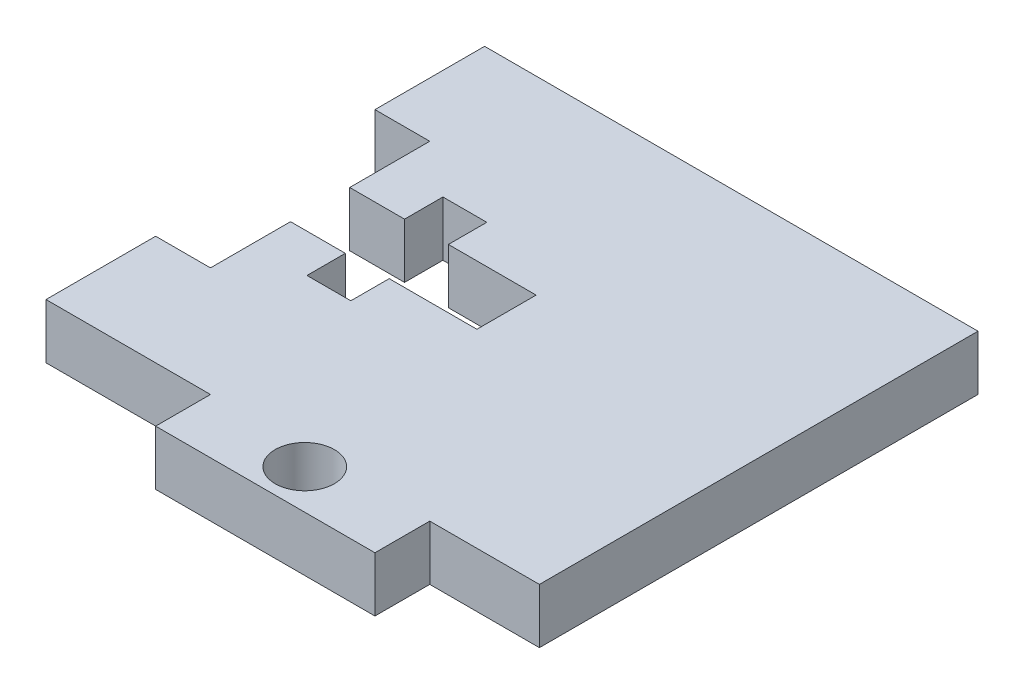
ISO-10303-21;
HEADER;
FILE_DESCRIPTION(('STEP AP214'),'2;1');
FILE_NAME('part.step','',(''),(''),'','','');
FILE_SCHEMA(('AUTOMOTIVE_DESIGN { 1 0 10303 214 1 1 1 1 }'));
ENDSEC;
DATA;
#1=APPLICATION_CONTEXT('core data for automotive mechanical design processes');
#2=APPLICATION_PROTOCOL_DEFINITION('international standard','automotive_design',2000,#1);
#3=PRODUCT_CONTEXT('',#1,'mechanical');
#4=PRODUCT('Part','Part','',(#3));
#5=PRODUCT_RELATED_PRODUCT_CATEGORY('part','',(#4));
#6=PRODUCT_DEFINITION_FORMATION('','',#4);
#7=PRODUCT_DEFINITION_CONTEXT('part definition',#1,'design');
#8=PRODUCT_DEFINITION('design','',#6,#7);
#9=PRODUCT_DEFINITION_SHAPE('','',#8);
#10=(LENGTH_UNIT() NAMED_UNIT(*) SI_UNIT(.MILLI.,.METRE.));
#11=(NAMED_UNIT(*) PLANE_ANGLE_UNIT() SI_UNIT($,.RADIAN.));
#12=(NAMED_UNIT(*) SI_UNIT($,.STERADIAN.) SOLID_ANGLE_UNIT());
#13=UNCERTAINTY_MEASURE_WITH_UNIT(LENGTH_MEASURE(1.E-05),#10,'distance_accuracy_value','');
#14=(GEOMETRIC_REPRESENTATION_CONTEXT(3) GLOBAL_UNCERTAINTY_ASSIGNED_CONTEXT((#13)) GLOBAL_UNIT_ASSIGNED_CONTEXT((#10,
#11,#12)) REPRESENTATION_CONTEXT('',''));
#15=CARTESIAN_POINT('',(0.,0.,0.));
#16=DIRECTION('',(0.,0.,1.));
#17=DIRECTION('',(1.,0.,0.));
#18=AXIS2_PLACEMENT_3D('',#15,#16,#17);
#19=CARTESIAN_POINT('',(0.,3.175,0.));
#20=DIRECTION('',(0.,-1.,0.));
#21=DIRECTION('',(0.,0.,-1.));
#22=AXIS2_PLACEMENT_3D('',#19,#20,#21);
#23=PLANE('',#22);
#24=DIRECTION('',(1.,0.,0.));
#25=VECTOR('',#24,1.);
#26=CARTESIAN_POINT('',(0.,3.175,0.));
#27=LINE('',#26,#25);
#28=CARTESIAN_POINT('',(0.,3.175,0.));
#29=VERTEX_POINT('',#28);
#30=CARTESIAN_POINT('',(9.525,3.175,0.));
#31=VERTEX_POINT('',#30);
#32=EDGE_CURVE('E274',#29,#31,#27,.T.);
#33=ORIENTED_EDGE('',*,*,#32,.T.);
#34=DIRECTION('',(0.,0.,1.));
#35=VECTOR('',#34,1.);
#36=CARTESIAN_POINT('',(9.525,3.175,0.));
#37=LINE('',#36,#35);
#38=CARTESIAN_POINT('',(9.525,3.175,3.175));
#39=VERTEX_POINT('',#38);
#40=EDGE_CURVE('E142',#31,#39,#37,.T.);
#41=ORIENTED_EDGE('',*,*,#40,.T.);
#42=DIRECTION('',(1.,0.,0.));
#43=VECTOR('',#42,1.);
#44=CARTESIAN_POINT('',(9.525,3.175,3.175));
#45=LINE('',#44,#43);
#46=CARTESIAN_POINT('',(22.225,3.175,3.175));
#47=VERTEX_POINT('',#46);
#48=EDGE_CURVE('E337',#39,#47,#45,.T.);
#49=ORIENTED_EDGE('',*,*,#48,.T.);
#50=DIRECTION('',(0.,0.,-1.));
#51=VECTOR('',#50,1.);
#52=CARTESIAN_POINT('',(22.225,3.175,3.175));
#53=LINE('',#52,#51);
#54=CARTESIAN_POINT('',(22.225,3.175,0.));
#55=VERTEX_POINT('',#54);
#56=EDGE_CURVE('E356',#47,#55,#53,.T.);
#57=ORIENTED_EDGE('',*,*,#56,.T.);
#58=DIRECTION('',(1.,0.,0.));
#59=VECTOR('',#58,1.);
#60=CARTESIAN_POINT('',(22.225,3.175,0.));
#61=LINE('',#60,#59);
#62=CARTESIAN_POINT('',(28.575,3.175,0.));
#63=VERTEX_POINT('',#62);
#64=EDGE_CURVE('E353',#55,#63,#61,.T.);
#65=ORIENTED_EDGE('',*,*,#64,.T.);
#66=DIRECTION('',(0.,0.,-1.));
#67=VECTOR('',#66,1.);
#68=CARTESIAN_POINT('',(28.575,3.175,0.));
#69=LINE('',#68,#67);
#70=CARTESIAN_POINT('',(28.575,3.175,-25.4));
#71=VERTEX_POINT('',#70);
#72=EDGE_CURVE('E355',#63,#71,#69,.T.);
#73=ORIENTED_EDGE('',*,*,#72,.T.);
#74=DIRECTION('',(-1.,0.,0.));
#75=VECTOR('',#74,1.);
#76=CARTESIAN_POINT('',(0.,3.175,-25.4));
#77=LINE('',#76,#75);
#78=CARTESIAN_POINT('',(0.,3.175,-25.4));
#79=VERTEX_POINT('',#78);
#80=EDGE_CURVE('E358',#71,#79,#77,.T.);
#81=ORIENTED_EDGE('',*,*,#80,.T.);
#82=DIRECTION('',(0.,0.,1.));
#83=VECTOR('',#82,1.);
#84=CARTESIAN_POINT('',(0.,3.175,-19.05));
#85=LINE('',#84,#83);
#86=CARTESIAN_POINT('',(0.,3.175,-19.05));
#87=VERTEX_POINT('',#86);
#88=EDGE_CURVE('E364',#79,#87,#85,.T.);
#89=ORIENTED_EDGE('',*,*,#88,.T.);
#90=DIRECTION('',(1.,0.,0.));
#91=VECTOR('',#90,1.);
#92=CARTESIAN_POINT('',(0.,3.175,-19.05));
#93=LINE('',#92,#91);
#94=CARTESIAN_POINT('',(3.175,3.175,-19.05));
#95=VERTEX_POINT('',#94);
#96=EDGE_CURVE('E366',#87,#95,#93,.T.);
#97=ORIENTED_EDGE('',*,*,#96,.T.);
#98=DIRECTION('',(0.,0.,1.));
#99=VECTOR('',#98,1.);
#100=CARTESIAN_POINT('',(3.175,3.175,-19.05));
#101=LINE('',#100,#99);
#102=CARTESIAN_POINT('',(3.175,3.175,-14.4145));
#103=VERTEX_POINT('',#102);
#104=EDGE_CURVE('E368',#95,#103,#101,.T.);
#105=ORIENTED_EDGE('',*,*,#104,.T.);
#106=DIRECTION('',(1.,0.,0.));
#107=VECTOR('',#106,1.);
#108=CARTESIAN_POINT('',(3.175,3.175,-14.4145));
#109=LINE('',#108,#107);
#110=CARTESIAN_POINT('',(6.35,3.175,-14.4145));
#111=VERTEX_POINT('',#110);
#112=EDGE_CURVE('E370',#103,#111,#109,.T.);
#113=ORIENTED_EDGE('',*,*,#112,.T.);
#114=DIRECTION('',(0.,0.,-1.));
#115=VECTOR('',#114,1.);
#116=CARTESIAN_POINT('',(6.35,3.175,-14.4145));
#117=LINE('',#116,#115);
#118=CARTESIAN_POINT('',(6.35,3.175,-16.637));
#119=VERTEX_POINT('',#118);
#120=EDGE_CURVE('E372',#111,#119,#117,.T.);
#121=ORIENTED_EDGE('',*,*,#120,.T.);
#122=DIRECTION('',(1.,0.,0.));
#123=VECTOR('',#122,1.);
#124=CARTESIAN_POINT('',(6.35,3.175,-16.637));
#125=LINE('',#124,#123);
#126=CARTESIAN_POINT('',(8.89,3.175,-16.637));
#127=VERTEX_POINT('',#126);
#128=EDGE_CURVE('E374',#119,#127,#125,.T.);
#129=ORIENTED_EDGE('',*,*,#128,.T.);
#130=DIRECTION('',(0.,0.,1.));
#131=VECTOR('',#130,1.);
#132=CARTESIAN_POINT('',(8.89,3.175,-16.637));
#133=LINE('',#132,#131);
#134=CARTESIAN_POINT('',(8.89,3.175,-14.4145));
#135=VERTEX_POINT('',#134);
#136=EDGE_CURVE('E376',#127,#135,#133,.T.);
#137=ORIENTED_EDGE('',*,*,#136,.T.);
#138=DIRECTION('',(1.,0.,0.));
#139=VECTOR('',#138,1.);
#140=CARTESIAN_POINT('',(8.89,3.175,-14.4145));
#141=LINE('',#140,#139);
#142=CARTESIAN_POINT('',(13.97,3.175,-14.4145));
#143=VERTEX_POINT('',#142);
#144=EDGE_CURVE('E378',#135,#143,#141,.T.);
#145=ORIENTED_EDGE('',*,*,#144,.T.);
#146=DIRECTION('',(0.,0.,1.));
#147=VECTOR('',#146,1.);
#148=CARTESIAN_POINT('',(13.97,3.175,-10.9855));
#149=LINE('',#148,#147);
#150=CARTESIAN_POINT('',(13.97,3.175,-10.9855));
#151=VERTEX_POINT('',#150);
#152=EDGE_CURVE('E380',#143,#151,#149,.T.);
#153=ORIENTED_EDGE('',*,*,#152,.T.);
#154=DIRECTION('',(-1.,0.,0.));
#155=VECTOR('',#154,1.);
#156=CARTESIAN_POINT('',(8.89,3.175,-10.9855));
#157=LINE('',#156,#155);
#158=CARTESIAN_POINT('',(8.89,3.175,-10.9855));
#159=VERTEX_POINT('',#158);
#160=EDGE_CURVE('E382',#151,#159,#157,.T.);
#161=ORIENTED_EDGE('',*,*,#160,.T.);
#162=DIRECTION('',(0.,0.,1.));
#163=VECTOR('',#162,1.);
#164=CARTESIAN_POINT('',(8.89,3.175,-8.763));
#165=LINE('',#164,#163);
#166=CARTESIAN_POINT('',(8.89,3.175,-8.763));
#167=VERTEX_POINT('',#166);
#168=EDGE_CURVE('E384',#159,#167,#165,.T.);
#169=ORIENTED_EDGE('',*,*,#168,.T.);
#170=DIRECTION('',(-1.,0.,0.));
#171=VECTOR('',#170,1.);
#172=CARTESIAN_POINT('',(6.35,3.175,-8.763));
#173=LINE('',#172,#171);
#174=CARTESIAN_POINT('',(6.35,3.175,-8.763));
#175=VERTEX_POINT('',#174);
#176=EDGE_CURVE('E386',#167,#175,#173,.T.);
#177=ORIENTED_EDGE('',*,*,#176,.T.);
#178=DIRECTION('',(0.,0.,-1.));
#179=VECTOR('',#178,1.);
#180=CARTESIAN_POINT('',(6.35,3.175,-10.9855));
#181=LINE('',#180,#179);
#182=CARTESIAN_POINT('',(6.35,3.175,-10.9855));
#183=VERTEX_POINT('',#182);
#184=EDGE_CURVE('E388',#175,#183,#181,.T.);
#185=ORIENTED_EDGE('',*,*,#184,.T.);
#186=DIRECTION('',(-1.,0.,0.));
#187=VECTOR('',#186,1.);
#188=CARTESIAN_POINT('',(3.175,3.175,-10.9855));
#189=LINE('',#188,#187);
#190=CARTESIAN_POINT('',(3.175,3.175,-10.9855));
#191=VERTEX_POINT('',#190);
#192=EDGE_CURVE('E209',#183,#191,#189,.T.);
#193=ORIENTED_EDGE('',*,*,#192,.T.);
#194=DIRECTION('',(0.,0.,1.));
#195=VECTOR('',#194,1.);
#196=CARTESIAN_POINT('',(3.175,3.175,-6.35));
#197=LINE('',#196,#195);
#198=CARTESIAN_POINT('',(3.175,3.175,-6.35));
#199=VERTEX_POINT('',#198);
#200=EDGE_CURVE('E203',#191,#199,#197,.T.);
#201=ORIENTED_EDGE('',*,*,#200,.T.);
#202=DIRECTION('',(-1.,0.,0.));
#203=VECTOR('',#202,1.);
#204=CARTESIAN_POINT('',(3.175,3.175,-6.35));
#205=LINE('',#204,#203);
#206=CARTESIAN_POINT('',(0.,3.175,-6.35));
#207=VERTEX_POINT('',#206);
#208=EDGE_CURVE('E207',#199,#207,#205,.T.);
#209=ORIENTED_EDGE('',*,*,#208,.T.);
#210=DIRECTION('',(0.,0.,1.));
#211=VECTOR('',#210,1.);
#212=CARTESIAN_POINT('',(0.,3.175,0.));
#213=LINE('',#212,#211);
#214=EDGE_CURVE('E51',#207,#29,#213,.T.);
#215=ORIENTED_EDGE('',*,*,#214,.T.);
#216=EDGE_LOOP('',(#33,#41,#49,#57,#65,#73,#81,#89,#97,#105,#113,#121,#129,#137,#145,#153,#161,
#169,#177,#185,#193,#201,#209,#215));
#217=FACE_BOUND('',#216,.T.);
#218=CARTESIAN_POINT('',(15.875,3.175,0.889));
#219=DIRECTION('',(0.,1.,0.));
#220=DIRECTION('',(0.,0.,1.));
#221=AXIS2_PLACEMENT_3D('',#218,#219,#220);
#222=CIRCLE('',#221,1.71449999999999);
#223=CARTESIAN_POINT('',(15.875,3.175,2.60349999999999));
#224=VERTEX_POINT('',#223);
#225=EDGE_CURVE('E231',#224,#224,#222,.T.);
#226=ORIENTED_EDGE('',*,*,#225,.F.);
#227=EDGE_LOOP('',(#226));
#228=FACE_BOUND('',#227,.T.);
#229=ADVANCED_FACE('F34',(#217,#228),#23,.F.);
#230=CARTESIAN_POINT('',(0.,0.,0.));
#231=DIRECTION('',(0.,-1.,0.));
#232=DIRECTION('',(0.,0.,-1.));
#233=AXIS2_PLACEMENT_3D('',#230,#231,#232);
#234=PLANE('',#233);
#235=DIRECTION('',(1.,0.,0.));
#236=VECTOR('',#235,1.);
#237=CARTESIAN_POINT('',(0.,0.,0.));
#238=LINE('',#237,#236);
#239=CARTESIAN_POINT('',(0.,0.,0.));
#240=VERTEX_POINT('',#239);
#241=CARTESIAN_POINT('',(9.525,0.,0.));
#242=VERTEX_POINT('',#241);
#243=EDGE_CURVE('E227',#240,#242,#238,.T.);
#244=ORIENTED_EDGE('',*,*,#243,.F.);
#245=DIRECTION('',(0.,0.,1.));
#246=VECTOR('',#245,1.);
#247=CARTESIAN_POINT('',(0.,0.,0.));
#248=LINE('',#247,#246);
#249=CARTESIAN_POINT('',(0.,0.,-6.35));
#250=VERTEX_POINT('',#249);
#251=EDGE_CURVE('E134',#250,#240,#248,.T.);
#252=ORIENTED_EDGE('',*,*,#251,.F.);
#253=DIRECTION('',(-1.,0.,0.));
#254=VECTOR('',#253,1.);
#255=CARTESIAN_POINT('',(3.175,0.,-6.35));
#256=LINE('',#255,#254);
#257=CARTESIAN_POINT('',(3.175,0.,-6.35));
#258=VERTEX_POINT('',#257);
#259=EDGE_CURVE('E128',#258,#250,#256,.T.);
#260=ORIENTED_EDGE('',*,*,#259,.F.);
#261=DIRECTION('',(0.,0.,1.));
#262=VECTOR('',#261,1.);
#263=CARTESIAN_POINT('',(3.175,0.,-6.35));
#264=LINE('',#263,#262);
#265=CARTESIAN_POINT('',(3.175,0.,-10.9855));
#266=VERTEX_POINT('',#265);
#267=EDGE_CURVE('E217',#266,#258,#264,.T.);
#268=ORIENTED_EDGE('',*,*,#267,.F.);
#269=DIRECTION('',(-1.,0.,0.));
#270=VECTOR('',#269,1.);
#271=CARTESIAN_POINT('',(3.175,0.,-10.9855));
#272=LINE('',#271,#270);
#273=CARTESIAN_POINT('',(6.35,0.,-10.9855));
#274=VERTEX_POINT('',#273);
#275=EDGE_CURVE('E269',#274,#266,#272,.T.);
#276=ORIENTED_EDGE('',*,*,#275,.F.);
#277=DIRECTION('',(0.,0.,-1.));
#278=VECTOR('',#277,1.);
#279=CARTESIAN_POINT('',(6.35,0.,-10.9855));
#280=LINE('',#279,#278);
#281=CARTESIAN_POINT('',(6.35,0.,-8.763));
#282=VERTEX_POINT('',#281);
#283=EDGE_CURVE('E267',#282,#274,#280,.T.);
#284=ORIENTED_EDGE('',*,*,#283,.F.);
#285=DIRECTION('',(-1.,0.,0.));
#286=VECTOR('',#285,1.);
#287=CARTESIAN_POINT('',(6.35,0.,-8.763));
#288=LINE('',#287,#286);
#289=CARTESIAN_POINT('',(8.89,0.,-8.763));
#290=VERTEX_POINT('',#289);
#291=EDGE_CURVE('E265',#290,#282,#288,.T.);
#292=ORIENTED_EDGE('',*,*,#291,.F.);
#293=DIRECTION('',(0.,0.,1.));
#294=VECTOR('',#293,1.);
#295=CARTESIAN_POINT('',(8.89,0.,-8.763));
#296=LINE('',#295,#294);
#297=CARTESIAN_POINT('',(8.89,0.,-10.9855));
#298=VERTEX_POINT('',#297);
#299=EDGE_CURVE('E263',#298,#290,#296,.T.);
#300=ORIENTED_EDGE('',*,*,#299,.F.);
#301=DIRECTION('',(-1.,0.,0.));
#302=VECTOR('',#301,1.);
#303=CARTESIAN_POINT('',(8.89,0.,-10.9855));
#304=LINE('',#303,#302);
#305=CARTESIAN_POINT('',(13.97,0.,-10.9855));
#306=VERTEX_POINT('',#305);
#307=EDGE_CURVE('E261',#306,#298,#304,.T.);
#308=ORIENTED_EDGE('',*,*,#307,.F.);
#309=DIRECTION('',(0.,0.,1.));
#310=VECTOR('',#309,1.);
#311=CARTESIAN_POINT('',(13.97,0.,-10.9855));
#312=LINE('',#311,#310);
#313=CARTESIAN_POINT('',(13.97,0.,-14.4145));
#314=VERTEX_POINT('',#313);
#315=EDGE_CURVE('E259',#314,#306,#312,.T.);
#316=ORIENTED_EDGE('',*,*,#315,.F.);
#317=DIRECTION('',(1.,0.,0.));
#318=VECTOR('',#317,1.);
#319=CARTESIAN_POINT('',(8.89,0.,-14.4145));
#320=LINE('',#319,#318);
#321=CARTESIAN_POINT('',(8.89,0.,-14.4145));
#322=VERTEX_POINT('',#321);
#323=EDGE_CURVE('E257',#322,#314,#320,.T.);
#324=ORIENTED_EDGE('',*,*,#323,.F.);
#325=DIRECTION('',(0.,0.,1.));
#326=VECTOR('',#325,1.);
#327=CARTESIAN_POINT('',(8.89,0.,-16.637));
#328=LINE('',#327,#326);
#329=CARTESIAN_POINT('',(8.89,0.,-16.637));
#330=VERTEX_POINT('',#329);
#331=EDGE_CURVE('E255',#330,#322,#328,.T.);
#332=ORIENTED_EDGE('',*,*,#331,.F.);
#333=DIRECTION('',(1.,0.,0.));
#334=VECTOR('',#333,1.);
#335=CARTESIAN_POINT('',(6.35,0.,-16.637));
#336=LINE('',#335,#334);
#337=CARTESIAN_POINT('',(6.35,0.,-16.637));
#338=VERTEX_POINT('',#337);
#339=EDGE_CURVE('E253',#338,#330,#336,.T.);
#340=ORIENTED_EDGE('',*,*,#339,.F.);
#341=DIRECTION('',(0.,0.,-1.));
#342=VECTOR('',#341,1.);
#343=CARTESIAN_POINT('',(6.35,0.,-14.4145));
#344=LINE('',#343,#342);
#345=CARTESIAN_POINT('',(6.35,0.,-14.4145));
#346=VERTEX_POINT('',#345);
#347=EDGE_CURVE('E251',#346,#338,#344,.T.);
#348=ORIENTED_EDGE('',*,*,#347,.F.);
#349=DIRECTION('',(1.,0.,0.));
#350=VECTOR('',#349,1.);
#351=CARTESIAN_POINT('',(3.175,0.,-14.4145));
#352=LINE('',#351,#350);
#353=CARTESIAN_POINT('',(3.175,0.,-14.4145));
#354=VERTEX_POINT('',#353);
#355=EDGE_CURVE('E249',#354,#346,#352,.T.);
#356=ORIENTED_EDGE('',*,*,#355,.F.);
#357=DIRECTION('',(0.,0.,1.));
#358=VECTOR('',#357,1.);
#359=CARTESIAN_POINT('',(3.175,0.,-19.05));
#360=LINE('',#359,#358);
#361=CARTESIAN_POINT('',(3.175,0.,-19.05));
#362=VERTEX_POINT('',#361);
#363=EDGE_CURVE('E247',#362,#354,#360,.T.);
#364=ORIENTED_EDGE('',*,*,#363,.F.);
#365=DIRECTION('',(1.,0.,0.));
#366=VECTOR('',#365,1.);
#367=CARTESIAN_POINT('',(0.,0.,-19.05));
#368=LINE('',#367,#366);
#369=CARTESIAN_POINT('',(0.,0.,-19.05));
#370=VERTEX_POINT('',#369);
#371=EDGE_CURVE('E245',#370,#362,#368,.T.);
#372=ORIENTED_EDGE('',*,*,#371,.F.);
#373=DIRECTION('',(0.,0.,1.));
#374=VECTOR('',#373,1.);
#375=CARTESIAN_POINT('',(0.,0.,-19.05));
#376=LINE('',#375,#374);
#377=CARTESIAN_POINT('',(0.,0.,-25.4));
#378=VERTEX_POINT('',#377);
#379=EDGE_CURVE('E243',#378,#370,#376,.T.);
#380=ORIENTED_EDGE('',*,*,#379,.F.);
#381=DIRECTION('',(-1.,0.,0.));
#382=VECTOR('',#381,1.);
#383=CARTESIAN_POINT('',(0.,0.,-25.4));
#384=LINE('',#383,#382);
#385=CARTESIAN_POINT('',(28.575,0.,-25.4));
#386=VERTEX_POINT('',#385);
#387=EDGE_CURVE('E241',#386,#378,#384,.T.);
#388=ORIENTED_EDGE('',*,*,#387,.F.);
#389=DIRECTION('',(0.,0.,-1.));
#390=VECTOR('',#389,1.);
#391=CARTESIAN_POINT('',(28.575,0.,0.));
#392=LINE('',#391,#390);
#393=CARTESIAN_POINT('',(28.575,0.,0.));
#394=VERTEX_POINT('',#393);
#395=EDGE_CURVE('E239',#394,#386,#392,.T.);
#396=ORIENTED_EDGE('',*,*,#395,.F.);
#397=DIRECTION('',(1.,0.,0.));
#398=VECTOR('',#397,1.);
#399=CARTESIAN_POINT('',(22.225,0.,0.));
#400=LINE('',#399,#398);
#401=CARTESIAN_POINT('',(22.225,0.,0.));
#402=VERTEX_POINT('',#401);
#403=EDGE_CURVE('E237',#402,#394,#400,.T.);
#404=ORIENTED_EDGE('',*,*,#403,.F.);
#405=DIRECTION('',(0.,0.,-1.));
#406=VECTOR('',#405,1.);
#407=CARTESIAN_POINT('',(22.225,0.,3.175));
#408=LINE('',#407,#406);
#409=CARTESIAN_POINT('',(22.225,0.,3.175));
#410=VERTEX_POINT('',#409);
#411=EDGE_CURVE('E235',#410,#402,#408,.T.);
#412=ORIENTED_EDGE('',*,*,#411,.F.);
#413=DIRECTION('',(1.,0.,0.));
#414=VECTOR('',#413,1.);
#415=CARTESIAN_POINT('',(9.525,0.,3.175));
#416=LINE('',#415,#414);
#417=CARTESIAN_POINT('',(9.525,0.,3.175));
#418=VERTEX_POINT('',#417);
#419=EDGE_CURVE('E233',#418,#410,#416,.T.);
#420=ORIENTED_EDGE('',*,*,#419,.F.);
#421=DIRECTION('',(0.,0.,1.));
#422=VECTOR('',#421,1.);
#423=CARTESIAN_POINT('',(9.525,0.,0.));
#424=LINE('',#423,#422);
#425=EDGE_CURVE('E230',#242,#418,#424,.T.);
#426=ORIENTED_EDGE('',*,*,#425,.F.);
#427=EDGE_LOOP('',(#244,#252,#260,#268,#276,#284,#292,#300,#308,#316,#324,#332,#340,#348,#356,
#364,#372,#380,#388,#396,#404,#412,#420,#426));
#428=FACE_BOUND('',#427,.T.);
#429=CARTESIAN_POINT('',(15.875,0.,0.889));
#430=DIRECTION('',(0.,1.,0.));
#431=DIRECTION('',(0.,0.,1.));
#432=AXIS2_PLACEMENT_3D('',#429,#430,#431);
#433=CIRCLE('',#432,1.71449999999999);
#434=CARTESIAN_POINT('',(15.875,0.,2.60349999999999));
#435=VERTEX_POINT('',#434);
#436=EDGE_CURVE('E691',#435,#435,#433,.T.);
#437=ORIENTED_EDGE('',*,*,#436,.T.);
#438=EDGE_LOOP('',(#437));
#439=FACE_BOUND('',#438,.T.);
#440=ADVANCED_FACE('F341',(#428,#439),#234,.T.);
#441=CARTESIAN_POINT('',(0.,3.175,0.));
#442=DIRECTION('',(0.,0.,-1.));
#443=DIRECTION('',(-1.,0.,0.));
#444=AXIS2_PLACEMENT_3D('',#441,#442,#443);
#445=PLANE('',#444);
#446=ORIENTED_EDGE('',*,*,#243,.T.);
#447=DIRECTION('',(0.,-1.,0.));
#448=VECTOR('',#447,1.);
#449=CARTESIAN_POINT('',(9.525,3.175,0.));
#450=LINE('',#449,#448);
#451=EDGE_CURVE('E11',#31,#242,#450,.T.);
#452=ORIENTED_EDGE('',*,*,#451,.F.);
#453=ORIENTED_EDGE('',*,*,#32,.F.);
#454=DIRECTION('',(0.,-1.,0.));
#455=VECTOR('',#454,1.);
#456=CARTESIAN_POINT('',(0.,3.175,0.));
#457=LINE('',#456,#455);
#458=EDGE_CURVE('E223',#29,#240,#457,.T.);
#459=ORIENTED_EDGE('',*,*,#458,.T.);
#460=EDGE_LOOP('',(#446,#452,#453,#459));
#461=FACE_BOUND('',#460,.T.);
#462=ADVANCED_FACE('F36',(#461),#445,.F.);
#463=CARTESIAN_POINT('',(9.525,3.175,0.));
#464=DIRECTION('',(1.,0.,0.));
#465=DIRECTION('',(0.,0.,-1.));
#466=AXIS2_PLACEMENT_3D('',#463,#464,#465);
#467=PLANE('',#466);
#468=ORIENTED_EDGE('',*,*,#425,.T.);
#469=DIRECTION('',(0.,-1.,0.));
#470=VECTOR('',#469,1.);
#471=CARTESIAN_POINT('',(9.525,3.175,3.175));
#472=LINE('',#471,#470);
#473=EDGE_CURVE('E43',#39,#418,#472,.T.);
#474=ORIENTED_EDGE('',*,*,#473,.F.);
#475=ORIENTED_EDGE('',*,*,#40,.F.);
#476=ORIENTED_EDGE('',*,*,#451,.T.);
#477=EDGE_LOOP('',(#468,#474,#475,#476));
#478=FACE_BOUND('',#477,.T.);
#479=ADVANCED_FACE('F422',(#478),#467,.F.);
#480=CARTESIAN_POINT('',(9.525,3.175,3.175));
#481=DIRECTION('',(0.,0.,-1.));
#482=DIRECTION('',(-1.,0.,0.));
#483=AXIS2_PLACEMENT_3D('',#480,#481,#482);
#484=PLANE('',#483);
#485=ORIENTED_EDGE('',*,*,#419,.T.);
#486=DIRECTION('',(0.,-1.,0.));
#487=VECTOR('',#486,1.);
#488=CARTESIAN_POINT('',(22.225,3.175,3.175));
#489=LINE('',#488,#487);
#490=EDGE_CURVE('E329',#47,#410,#489,.T.);
#491=ORIENTED_EDGE('',*,*,#490,.F.);
#492=ORIENTED_EDGE('',*,*,#48,.F.);
#493=ORIENTED_EDGE('',*,*,#473,.T.);
#494=EDGE_LOOP('',(#485,#491,#492,#493));
#495=FACE_BOUND('',#494,.T.);
#496=ADVANCED_FACE('F335',(#495),#484,.F.);
#497=CARTESIAN_POINT('',(22.225,3.175,3.175));
#498=DIRECTION('',(-1.,0.,0.));
#499=DIRECTION('',(0.,0.,1.));
#500=AXIS2_PLACEMENT_3D('',#497,#498,#499);
#501=PLANE('',#500);
#502=ORIENTED_EDGE('',*,*,#411,.T.);
#503=DIRECTION('',(0.,-1.,0.));
#504=VECTOR('',#503,1.);
#505=CARTESIAN_POINT('',(22.225,3.175,0.));
#506=LINE('',#505,#504);
#507=EDGE_CURVE('E326',#55,#402,#506,.T.);
#508=ORIENTED_EDGE('',*,*,#507,.F.);
#509=ORIENTED_EDGE('',*,*,#56,.F.);
#510=ORIENTED_EDGE('',*,*,#490,.T.);
#511=EDGE_LOOP('',(#502,#508,#509,#510));
#512=FACE_BOUND('',#511,.T.);
#513=ADVANCED_FACE('F347',(#512),#501,.F.);
#514=CARTESIAN_POINT('',(22.225,3.175,0.));
#515=DIRECTION('',(0.,0.,-1.));
#516=DIRECTION('',(-1.,0.,0.));
#517=AXIS2_PLACEMENT_3D('',#514,#515,#516);
#518=PLANE('',#517);
#519=ORIENTED_EDGE('',*,*,#403,.T.);
#520=DIRECTION('',(0.,-1.,0.));
#521=VECTOR('',#520,1.);
#522=CARTESIAN_POINT('',(28.575,3.175,0.));
#523=LINE('',#522,#521);
#524=EDGE_CURVE('E323',#63,#394,#523,.T.);
#525=ORIENTED_EDGE('',*,*,#524,.F.);
#526=ORIENTED_EDGE('',*,*,#64,.F.);
#527=ORIENTED_EDGE('',*,*,#507,.T.);
#528=EDGE_LOOP('',(#519,#525,#526,#527));
#529=FACE_BOUND('',#528,.T.);
#530=ADVANCED_FACE('F351',(#529),#518,.F.);
#531=CARTESIAN_POINT('',(28.575,3.175,0.));
#532=DIRECTION('',(-1.,0.,0.));
#533=DIRECTION('',(0.,0.,1.));
#534=AXIS2_PLACEMENT_3D('',#531,#532,#533);
#535=PLANE('',#534);
#536=ORIENTED_EDGE('',*,*,#395,.T.);
#537=DIRECTION('',(0.,-1.,0.));
#538=VECTOR('',#537,1.);
#539=CARTESIAN_POINT('',(28.575,3.175,-25.4));
#540=LINE('',#539,#538);
#541=EDGE_CURVE('E320',#71,#386,#540,.T.);
#542=ORIENTED_EDGE('',*,*,#541,.F.);
#543=ORIENTED_EDGE('',*,*,#72,.F.);
#544=ORIENTED_EDGE('',*,*,#524,.T.);
#545=EDGE_LOOP('',(#536,#542,#543,#544));
#546=FACE_BOUND('',#545,.T.);
#547=ADVANCED_FACE('F435',(#546),#535,.F.);
#548=CARTESIAN_POINT('',(0.,3.175,-25.4));
#549=DIRECTION('',(0.,0.,1.));
#550=DIRECTION('',(1.,0.,0.));
#551=AXIS2_PLACEMENT_3D('',#548,#549,#550);
#552=PLANE('',#551);
#553=ORIENTED_EDGE('',*,*,#387,.T.);
#554=DIRECTION('',(0.,-1.,0.));
#555=VECTOR('',#554,1.);
#556=CARTESIAN_POINT('',(0.,3.175,-25.4));
#557=LINE('',#556,#555);
#558=EDGE_CURVE('E317',#79,#378,#557,.T.);
#559=ORIENTED_EDGE('',*,*,#558,.F.);
#560=ORIENTED_EDGE('',*,*,#80,.F.);
#561=ORIENTED_EDGE('',*,*,#541,.T.);
#562=EDGE_LOOP('',(#553,#559,#560,#561));
#563=FACE_BOUND('',#562,.T.);
#564=ADVANCED_FACE('F438',(#563),#552,.F.);
#565=CARTESIAN_POINT('',(0.,3.175,-19.05));
#566=DIRECTION('',(1.,0.,0.));
#567=DIRECTION('',(0.,0.,-1.));
#568=AXIS2_PLACEMENT_3D('',#565,#566,#567);
#569=PLANE('',#568);
#570=ORIENTED_EDGE('',*,*,#379,.T.);
#571=DIRECTION('',(0.,-1.,0.));
#572=VECTOR('',#571,1.);
#573=CARTESIAN_POINT('',(0.,3.175,-19.05));
#574=LINE('',#573,#572);
#575=EDGE_CURVE('E314',#87,#370,#574,.T.);
#576=ORIENTED_EDGE('',*,*,#575,.F.);
#577=ORIENTED_EDGE('',*,*,#88,.F.);
#578=ORIENTED_EDGE('',*,*,#558,.T.);
#579=EDGE_LOOP('',(#570,#576,#577,#578));
#580=FACE_BOUND('',#579,.T.);
#581=ADVANCED_FACE('F442',(#580),#569,.F.);
#582=CARTESIAN_POINT('',(0.,3.175,-19.05));
#583=DIRECTION('',(0.,0.,-1.));
#584=DIRECTION('',(-1.,0.,0.));
#585=AXIS2_PLACEMENT_3D('',#582,#583,#584);
#586=PLANE('',#585);
#587=ORIENTED_EDGE('',*,*,#371,.T.);
#588=DIRECTION('',(0.,-1.,0.));
#589=VECTOR('',#588,1.);
#590=CARTESIAN_POINT('',(3.175,3.175,-19.05));
#591=LINE('',#590,#589);
#592=EDGE_CURVE('E311',#95,#362,#591,.T.);
#593=ORIENTED_EDGE('',*,*,#592,.F.);
#594=ORIENTED_EDGE('',*,*,#96,.F.);
#595=ORIENTED_EDGE('',*,*,#575,.T.);
#596=EDGE_LOOP('',(#587,#593,#594,#595));
#597=FACE_BOUND('',#596,.T.);
#598=ADVANCED_FACE('F446',(#597),#586,.F.);
#599=CARTESIAN_POINT('',(3.175,3.175,-19.05));
#600=DIRECTION('',(1.,0.,0.));
#601=DIRECTION('',(0.,0.,-1.));
#602=AXIS2_PLACEMENT_3D('',#599,#600,#601);
#603=PLANE('',#602);
#604=ORIENTED_EDGE('',*,*,#363,.T.);
#605=DIRECTION('',(0.,-1.,0.));
#606=VECTOR('',#605,1.);
#607=CARTESIAN_POINT('',(3.175,3.175,-14.4145));
#608=LINE('',#607,#606);
#609=EDGE_CURVE('E308',#103,#354,#608,.T.);
#610=ORIENTED_EDGE('',*,*,#609,.F.);
#611=ORIENTED_EDGE('',*,*,#104,.F.);
#612=ORIENTED_EDGE('',*,*,#592,.T.);
#613=EDGE_LOOP('',(#604,#610,#611,#612));
#614=FACE_BOUND('',#613,.T.);
#615=ADVANCED_FACE('F450',(#614),#603,.F.);
#616=CARTESIAN_POINT('',(3.175,3.175,-14.4145));
#617=DIRECTION('',(0.,0.,-1.));
#618=DIRECTION('',(-1.,0.,0.));
#619=AXIS2_PLACEMENT_3D('',#616,#617,#618);
#620=PLANE('',#619);
#621=ORIENTED_EDGE('',*,*,#355,.T.);
#622=DIRECTION('',(0.,-1.,0.));
#623=VECTOR('',#622,1.);
#624=CARTESIAN_POINT('',(6.35,3.175,-14.4145));
#625=LINE('',#624,#623);
#626=EDGE_CURVE('E305',#111,#346,#625,.T.);
#627=ORIENTED_EDGE('',*,*,#626,.F.);
#628=ORIENTED_EDGE('',*,*,#112,.F.);
#629=ORIENTED_EDGE('',*,*,#609,.T.);
#630=EDGE_LOOP('',(#621,#627,#628,#629));
#631=FACE_BOUND('',#630,.T.);
#632=ADVANCED_FACE('F454',(#631),#620,.F.);
#633=CARTESIAN_POINT('',(6.35,3.175,-14.4145));
#634=DIRECTION('',(-1.,0.,0.));
#635=DIRECTION('',(0.,0.,1.));
#636=AXIS2_PLACEMENT_3D('',#633,#634,#635);
#637=PLANE('',#636);
#638=ORIENTED_EDGE('',*,*,#347,.T.);
#639=DIRECTION('',(0.,-1.,0.));
#640=VECTOR('',#639,1.);
#641=CARTESIAN_POINT('',(6.35,3.175,-16.637));
#642=LINE('',#641,#640);
#643=EDGE_CURVE('E302',#119,#338,#642,.T.);
#644=ORIENTED_EDGE('',*,*,#643,.F.);
#645=ORIENTED_EDGE('',*,*,#120,.F.);
#646=ORIENTED_EDGE('',*,*,#626,.T.);
#647=EDGE_LOOP('',(#638,#644,#645,#646));
#648=FACE_BOUND('',#647,.T.);
#649=ADVANCED_FACE('F458',(#648),#637,.F.);
#650=CARTESIAN_POINT('',(6.35,3.175,-16.637));
#651=DIRECTION('',(0.,0.,-1.));
#652=DIRECTION('',(-1.,0.,0.));
#653=AXIS2_PLACEMENT_3D('',#650,#651,#652);
#654=PLANE('',#653);
#655=ORIENTED_EDGE('',*,*,#339,.T.);
#656=DIRECTION('',(0.,-1.,0.));
#657=VECTOR('',#656,1.);
#658=CARTESIAN_POINT('',(8.89,3.175,-16.637));
#659=LINE('',#658,#657);
#660=EDGE_CURVE('E299',#127,#330,#659,.T.);
#661=ORIENTED_EDGE('',*,*,#660,.F.);
#662=ORIENTED_EDGE('',*,*,#128,.F.);
#663=ORIENTED_EDGE('',*,*,#643,.T.);
#664=EDGE_LOOP('',(#655,#661,#662,#663));
#665=FACE_BOUND('',#664,.T.);
#666=ADVANCED_FACE('F462',(#665),#654,.F.);
#667=CARTESIAN_POINT('',(8.89,3.175,-16.637));
#668=DIRECTION('',(1.,0.,0.));
#669=DIRECTION('',(0.,0.,-1.));
#670=AXIS2_PLACEMENT_3D('',#667,#668,#669);
#671=PLANE('',#670);
#672=ORIENTED_EDGE('',*,*,#331,.T.);
#673=DIRECTION('',(0.,-1.,0.));
#674=VECTOR('',#673,1.);
#675=CARTESIAN_POINT('',(8.89,3.175,-14.4145));
#676=LINE('',#675,#674);
#677=EDGE_CURVE('E296',#135,#322,#676,.T.);
#678=ORIENTED_EDGE('',*,*,#677,.F.);
#679=ORIENTED_EDGE('',*,*,#136,.F.);
#680=ORIENTED_EDGE('',*,*,#660,.T.);
#681=EDGE_LOOP('',(#672,#678,#679,#680));
#682=FACE_BOUND('',#681,.T.);
#683=ADVANCED_FACE('F466',(#682),#671,.F.);
#684=CARTESIAN_POINT('',(8.89,3.175,-14.4145));
#685=DIRECTION('',(0.,0.,-1.));
#686=DIRECTION('',(-1.,0.,0.));
#687=AXIS2_PLACEMENT_3D('',#684,#685,#686);
#688=PLANE('',#687);
#689=ORIENTED_EDGE('',*,*,#323,.T.);
#690=DIRECTION('',(0.,-1.,0.));
#691=VECTOR('',#690,1.);
#692=CARTESIAN_POINT('',(13.97,3.175,-14.4145));
#693=LINE('',#692,#691);
#694=EDGE_CURVE('E293',#143,#314,#693,.T.);
#695=ORIENTED_EDGE('',*,*,#694,.F.);
#696=ORIENTED_EDGE('',*,*,#144,.F.);
#697=ORIENTED_EDGE('',*,*,#677,.T.);
#698=EDGE_LOOP('',(#689,#695,#696,#697));
#699=FACE_BOUND('',#698,.T.);
#700=ADVANCED_FACE('F470',(#699),#688,.F.);
#701=CARTESIAN_POINT('',(13.97,3.175,-10.9855));
#702=DIRECTION('',(1.,0.,0.));
#703=DIRECTION('',(0.,0.,-1.));
#704=AXIS2_PLACEMENT_3D('',#701,#702,#703);
#705=PLANE('',#704);
#706=ORIENTED_EDGE('',*,*,#315,.T.);
#707=DIRECTION('',(0.,-1.,0.));
#708=VECTOR('',#707,1.);
#709=CARTESIAN_POINT('',(13.97,3.175,-10.9855));
#710=LINE('',#709,#708);
#711=EDGE_CURVE('E290',#151,#306,#710,.T.);
#712=ORIENTED_EDGE('',*,*,#711,.F.);
#713=ORIENTED_EDGE('',*,*,#152,.F.);
#714=ORIENTED_EDGE('',*,*,#694,.T.);
#715=EDGE_LOOP('',(#706,#712,#713,#714));
#716=FACE_BOUND('',#715,.T.);
#717=ADVANCED_FACE('F474',(#716),#705,.F.);
#718=CARTESIAN_POINT('',(8.89,3.175,-10.9855));
#719=DIRECTION('',(0.,0.,1.));
#720=DIRECTION('',(1.,0.,0.));
#721=AXIS2_PLACEMENT_3D('',#718,#719,#720);
#722=PLANE('',#721);
#723=ORIENTED_EDGE('',*,*,#307,.T.);
#724=DIRECTION('',(0.,-1.,0.));
#725=VECTOR('',#724,1.);
#726=CARTESIAN_POINT('',(8.89,3.175,-10.9855));
#727=LINE('',#726,#725);
#728=EDGE_CURVE('E287',#159,#298,#727,.T.);
#729=ORIENTED_EDGE('',*,*,#728,.F.);
#730=ORIENTED_EDGE('',*,*,#160,.F.);
#731=ORIENTED_EDGE('',*,*,#711,.T.);
#732=EDGE_LOOP('',(#723,#729,#730,#731));
#733=FACE_BOUND('',#732,.T.);
#734=ADVANCED_FACE('F478',(#733),#722,.F.);
#735=CARTESIAN_POINT('',(8.89,3.175,-8.763));
#736=DIRECTION('',(1.,0.,0.));
#737=DIRECTION('',(0.,0.,-1.));
#738=AXIS2_PLACEMENT_3D('',#735,#736,#737);
#739=PLANE('',#738);
#740=ORIENTED_EDGE('',*,*,#299,.T.);
#741=DIRECTION('',(0.,-1.,0.));
#742=VECTOR('',#741,1.);
#743=CARTESIAN_POINT('',(8.89,3.175,-8.763));
#744=LINE('',#743,#742);
#745=EDGE_CURVE('E284',#167,#290,#744,.T.);
#746=ORIENTED_EDGE('',*,*,#745,.F.);
#747=ORIENTED_EDGE('',*,*,#168,.F.);
#748=ORIENTED_EDGE('',*,*,#728,.T.);
#749=EDGE_LOOP('',(#740,#746,#747,#748));
#750=FACE_BOUND('',#749,.T.);
#751=ADVANCED_FACE('F482',(#750),#739,.F.);
#752=CARTESIAN_POINT('',(6.35,3.175,-8.763));
#753=DIRECTION('',(0.,0.,1.));
#754=DIRECTION('',(1.,0.,0.));
#755=AXIS2_PLACEMENT_3D('',#752,#753,#754);
#756=PLANE('',#755);
#757=ORIENTED_EDGE('',*,*,#291,.T.);
#758=DIRECTION('',(0.,-1.,0.));
#759=VECTOR('',#758,1.);
#760=CARTESIAN_POINT('',(6.35,3.175,-8.763));
#761=LINE('',#760,#759);
#762=EDGE_CURVE('E281',#175,#282,#761,.T.);
#763=ORIENTED_EDGE('',*,*,#762,.F.);
#764=ORIENTED_EDGE('',*,*,#176,.F.);
#765=ORIENTED_EDGE('',*,*,#745,.T.);
#766=EDGE_LOOP('',(#757,#763,#764,#765));
#767=FACE_BOUND('',#766,.T.);
#768=ADVANCED_FACE('F486',(#767),#756,.F.);
#769=CARTESIAN_POINT('',(6.35,3.175,-10.9855));
#770=DIRECTION('',(-1.,0.,0.));
#771=DIRECTION('',(0.,0.,1.));
#772=AXIS2_PLACEMENT_3D('',#769,#770,#771);
#773=PLANE('',#772);
#774=ORIENTED_EDGE('',*,*,#283,.T.);
#775=DIRECTION('',(0.,-1.,0.));
#776=VECTOR('',#775,1.);
#777=CARTESIAN_POINT('',(6.35,3.175,-10.9855));
#778=LINE('',#777,#776);
#779=EDGE_CURVE('E278',#183,#274,#778,.T.);
#780=ORIENTED_EDGE('',*,*,#779,.F.);
#781=ORIENTED_EDGE('',*,*,#184,.F.);
#782=ORIENTED_EDGE('',*,*,#762,.T.);
#783=EDGE_LOOP('',(#774,#780,#781,#782));
#784=FACE_BOUND('',#783,.T.);
#785=ADVANCED_FACE('F394',(#784),#773,.F.);
#786=CARTESIAN_POINT('',(3.175,3.175,-10.9855));
#787=DIRECTION('',(0.,0.,1.));
#788=DIRECTION('',(1.,0.,0.));
#789=AXIS2_PLACEMENT_3D('',#786,#787,#788);
#790=PLANE('',#789);
#791=ORIENTED_EDGE('',*,*,#275,.T.);
#792=DIRECTION('',(0.,-1.,0.));
#793=VECTOR('',#792,1.);
#794=CARTESIAN_POINT('',(3.175,3.175,-10.9855));
#795=LINE('',#794,#793);
#796=EDGE_CURVE('E218',#191,#266,#795,.T.);
#797=ORIENTED_EDGE('',*,*,#796,.F.);
#798=ORIENTED_EDGE('',*,*,#192,.F.);
#799=ORIENTED_EDGE('',*,*,#779,.T.);
#800=EDGE_LOOP('',(#791,#797,#798,#799));
#801=FACE_BOUND('',#800,.T.);
#802=ADVANCED_FACE('F398',(#801),#790,.F.);
#803=CARTESIAN_POINT('',(3.175,3.175,-6.35));
#804=DIRECTION('',(1.,0.,0.));
#805=DIRECTION('',(0.,0.,-1.));
#806=AXIS2_PLACEMENT_3D('',#803,#804,#805);
#807=PLANE('',#806);
#808=ORIENTED_EDGE('',*,*,#267,.T.);
#809=DIRECTION('',(0.,-1.,0.));
#810=VECTOR('',#809,1.);
#811=CARTESIAN_POINT('',(3.175,3.175,-6.35));
#812=LINE('',#811,#810);
#813=EDGE_CURVE('E214',#199,#258,#812,.T.);
#814=ORIENTED_EDGE('',*,*,#813,.F.);
#815=ORIENTED_EDGE('',*,*,#200,.F.);
#816=ORIENTED_EDGE('',*,*,#796,.T.);
#817=EDGE_LOOP('',(#808,#814,#815,#816));
#818=FACE_BOUND('',#817,.T.);
#819=ADVANCED_FACE('F215',(#818),#807,.F.);
#820=CARTESIAN_POINT('',(3.175,3.175,-6.35));
#821=DIRECTION('',(0.,0.,1.));
#822=DIRECTION('',(1.,0.,0.));
#823=AXIS2_PLACEMENT_3D('',#820,#821,#822);
#824=PLANE('',#823);
#825=ORIENTED_EDGE('',*,*,#259,.T.);
#826=DIRECTION('',(0.,-1.,0.));
#827=VECTOR('',#826,1.);
#828=CARTESIAN_POINT('',(0.,3.175,-6.35));
#829=LINE('',#828,#827);
#830=EDGE_CURVE('E219',#207,#250,#829,.T.);
#831=ORIENTED_EDGE('',*,*,#830,.F.);
#832=ORIENTED_EDGE('',*,*,#208,.F.);
#833=ORIENTED_EDGE('',*,*,#813,.T.);
#834=EDGE_LOOP('',(#825,#831,#832,#833));
#835=FACE_BOUND('',#834,.T.);
#836=ADVANCED_FACE('F221',(#835),#824,.F.);
#837=CARTESIAN_POINT('',(0.,3.175,0.));
#838=DIRECTION('',(1.,0.,0.));
#839=DIRECTION('',(0.,0.,-1.));
#840=AXIS2_PLACEMENT_3D('',#837,#838,#839);
#841=PLANE('',#840);
#842=ORIENTED_EDGE('',*,*,#251,.T.);
#843=ORIENTED_EDGE('',*,*,#458,.F.);
#844=ORIENTED_EDGE('',*,*,#214,.F.);
#845=ORIENTED_EDGE('',*,*,#830,.T.);
#846=EDGE_LOOP('',(#842,#843,#844,#845));
#847=FACE_BOUND('',#846,.T.);
#848=ADVANCED_FACE('F402',(#847),#841,.F.);
#849=CARTESIAN_POINT('',(15.875,3.175,0.889));
#850=DIRECTION('',(0.,-1.,0.));
#851=DIRECTION('',(0.,0.,-1.));
#852=AXIS2_PLACEMENT_3D('',#849,#850,#851);
#853=CYLINDRICAL_SURFACE('',#852,1.71449999999999);
#854=ORIENTED_EDGE('',*,*,#225,.T.);
#855=EDGE_LOOP('',(#854));
#856=FACE_BOUND('',#855,.T.);
#857=ORIENTED_EDGE('',*,*,#436,.F.);
#858=EDGE_LOOP('',(#857));
#859=FACE_BOUND('',#858,.T.);
#860=ADVANCED_FACE('F404',(#856,#859),#853,.F.);
#861=CLOSED_SHELL('',(#229,#440,#462,#479,#496,#513,#530,#547,#564,#581,#598,#615,#632,#649,
#666,#683,#700,#717,#734,#751,#768,#785,#802,#819,#836,#848,#860));
#862=MANIFOLD_SOLID_BREP('B2',#861);
#863=ADVANCED_BREP_SHAPE_REPRESENTATION('',(#18,#862),#14);
#864=SHAPE_DEFINITION_REPRESENTATION(#9,#863);
ENDSEC;
END-ISO-10303-21;
